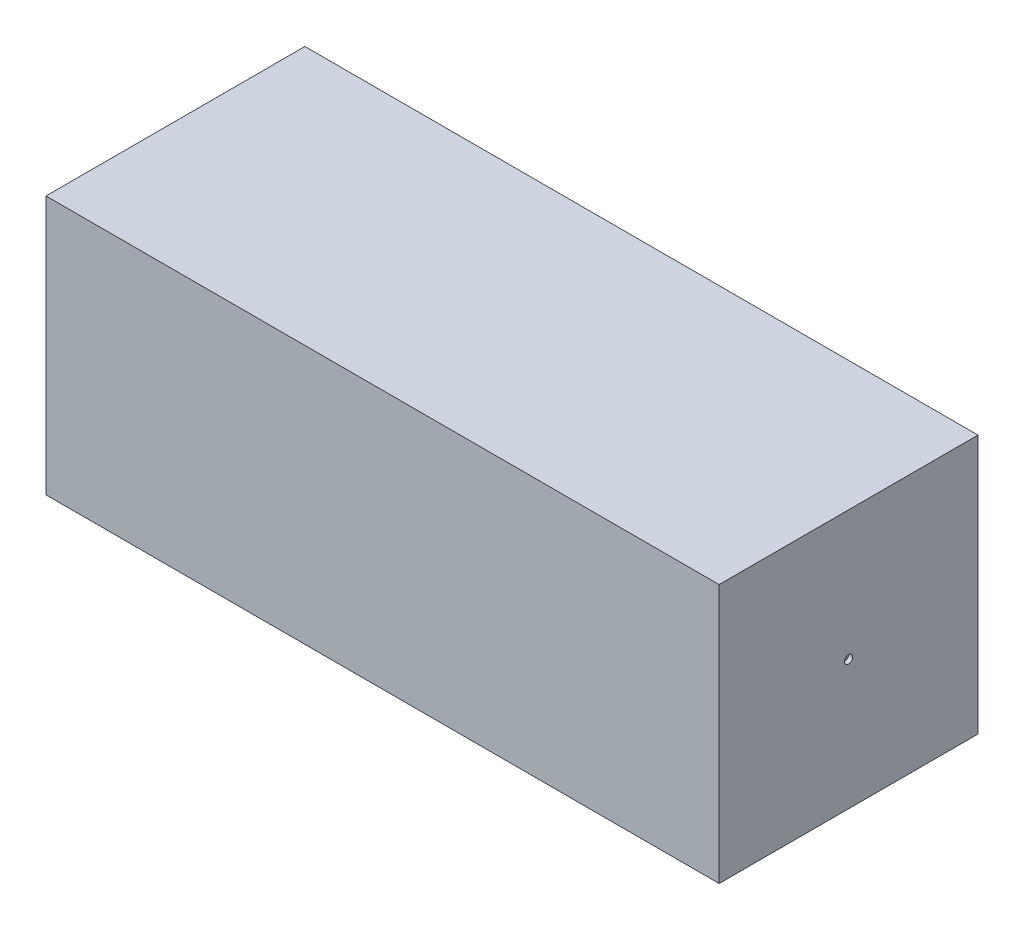
ISO-10303-21;
HEADER;
FILE_DESCRIPTION(('STEP AP214'),'2;1');
FILE_NAME('part.step','',(''),(''),'','','');
FILE_SCHEMA(('AUTOMOTIVE_DESIGN { 1 0 10303 214 1 1 1 1 }'));
ENDSEC;
DATA;
#1=APPLICATION_CONTEXT('core data for automotive mechanical design processes');
#2=APPLICATION_PROTOCOL_DEFINITION('international standard','automotive_design',2000,#1);
#3=PRODUCT_CONTEXT('',#1,'mechanical');
#4=PRODUCT('Part','Part','',(#3));
#5=PRODUCT_RELATED_PRODUCT_CATEGORY('part','',(#4));
#6=PRODUCT_DEFINITION_FORMATION('','',#4);
#7=PRODUCT_DEFINITION_CONTEXT('part definition',#1,'design');
#8=PRODUCT_DEFINITION('design','',#6,#7);
#9=PRODUCT_DEFINITION_SHAPE('','',#8);
#10=(LENGTH_UNIT() NAMED_UNIT(*) SI_UNIT(.MILLI.,.METRE.));
#11=(NAMED_UNIT(*) PLANE_ANGLE_UNIT() SI_UNIT($,.RADIAN.));
#12=(NAMED_UNIT(*) SI_UNIT($,.STERADIAN.) SOLID_ANGLE_UNIT());
#13=UNCERTAINTY_MEASURE_WITH_UNIT(LENGTH_MEASURE(1.E-05),#10,'distance_accuracy_value','');
#14=(GEOMETRIC_REPRESENTATION_CONTEXT(3) GLOBAL_UNCERTAINTY_ASSIGNED_CONTEXT((#13)) GLOBAL_UNIT_ASSIGNED_CONTEXT((#10,
#11,#12)) REPRESENTATION_CONTEXT('',''));
#15=CARTESIAN_POINT('',(0.,0.,0.));
#16=DIRECTION('',(0.,0.,1.));
#17=DIRECTION('',(1.,0.,0.));
#18=AXIS2_PLACEMENT_3D('',#15,#16,#17);
#19=CARTESIAN_POINT('',(164.1,31.75,-31.75));
#20=DIRECTION('',(1.,0.,0.));
#21=DIRECTION('',(0.,1.,0.));
#22=AXIS2_PLACEMENT_3D('',#19,#20,#21);
#23=PLANE('',#22);
#24=CARTESIAN_POINT('',(164.1,31.75,-31.75));
#25=DIRECTION('',(1.,0.,0.));
#26=DIRECTION('',(0.,0.,-1.));
#27=AXIS2_PLACEMENT_3D('',#24,#25,#26);
#28=CIRCLE('',#27,1.);
#29=CARTESIAN_POINT('',(164.1,31.75,-32.75));
#30=VERTEX_POINT('',#29);
#31=EDGE_CURVE('E11',#30,#30,#28,.T.);
#32=ORIENTED_EDGE('',*,*,#31,.T.);
#33=EDGE_LOOP('',(#32));
#34=FACE_BOUND('',#33,.T.);
#35=ADVANCED_FACE('F17',(#34),#23,.T.);
#36=CARTESIAN_POINT('',(164.1,31.75,-31.75));
#37=DIRECTION('',(1.,0.,0.));
#38=DIRECTION('',(0.,0.,-1.));
#39=AXIS2_PLACEMENT_3D('',#36,#37,#38);
#40=CYLINDRICAL_SURFACE('',#39,1.);
#41=ORIENTED_EDGE('',*,*,#31,.F.);
#42=EDGE_LOOP('',(#41));
#43=FACE_BOUND('',#42,.T.);
#44=CARTESIAN_POINT('',(165.1,31.75,-31.75));
#45=DIRECTION('',(1.,0.,0.));
#46=DIRECTION('',(0.,0.,-1.));
#47=AXIS2_PLACEMENT_3D('',#44,#45,#46);
#48=CIRCLE('',#47,1.);
#49=CARTESIAN_POINT('',(165.1,31.75,-32.75));
#50=VERTEX_POINT('',#49);
#51=EDGE_CURVE('E45',#50,#50,#48,.T.);
#52=ORIENTED_EDGE('',*,*,#51,.T.);
#53=EDGE_LOOP('',(#52));
#54=FACE_BOUND('',#53,.T.);
#55=ADVANCED_FACE('F163',(#43,#54),#40,.F.);
#56=CARTESIAN_POINT('',(0.,0.,0.));
#57=DIRECTION('',(0.,-1.,0.));
#58=DIRECTION('',(0.,0.,-1.));
#59=AXIS2_PLACEMENT_3D('',#56,#57,#58);
#60=PLANE('',#59);
#61=DIRECTION('',(0.,0.,1.));
#62=VECTOR('',#61,1.);
#63=CARTESIAN_POINT('',(0.,0.,0.));
#64=LINE('',#63,#62);
#65=CARTESIAN_POINT('',(0.,0.,-63.5));
#66=VERTEX_POINT('',#65);
#67=CARTESIAN_POINT('',(0.,0.,0.));
#68=VERTEX_POINT('',#67);
#69=EDGE_CURVE('E100',#66,#68,#64,.T.);
#70=ORIENTED_EDGE('',*,*,#69,.F.);
#71=DIRECTION('',(-1.,0.,0.));
#72=VECTOR('',#71,1.);
#73=CARTESIAN_POINT('',(0.,0.,-63.5));
#74=LINE('',#73,#72);
#75=CARTESIAN_POINT('',(165.1,0.,-63.5));
#76=VERTEX_POINT('',#75);
#77=EDGE_CURVE('E84',#76,#66,#74,.T.);
#78=ORIENTED_EDGE('',*,*,#77,.F.);
#79=DIRECTION('',(0.,0.,-1.));
#80=VECTOR('',#79,1.);
#81=CARTESIAN_POINT('',(165.1,0.,0.));
#82=LINE('',#81,#80);
#83=CARTESIAN_POINT('',(165.1,0.,0.));
#84=VERTEX_POINT('',#83);
#85=EDGE_CURVE('E102',#84,#76,#82,.T.);
#86=ORIENTED_EDGE('',*,*,#85,.F.);
#87=DIRECTION('',(1.,0.,0.));
#88=VECTOR('',#87,1.);
#89=CARTESIAN_POINT('',(0.,0.,0.));
#90=LINE('',#89,#88);
#91=EDGE_CURVE('E96',#68,#84,#90,.T.);
#92=ORIENTED_EDGE('',*,*,#91,.F.);
#93=EDGE_LOOP('',(#70,#78,#86,#92));
#94=FACE_BOUND('',#93,.T.);
#95=ADVANCED_FACE('F98',(#94),#60,.T.);
#96=CARTESIAN_POINT('',(0.,63.5,0.));
#97=DIRECTION('',(0.,-1.,0.));
#98=DIRECTION('',(0.,0.,-1.));
#99=AXIS2_PLACEMENT_3D('',#96,#97,#98);
#100=PLANE('',#99);
#101=DIRECTION('',(0.,0.,1.));
#102=VECTOR('',#101,1.);
#103=CARTESIAN_POINT('',(0.,63.5,0.));
#104=LINE('',#103,#102);
#105=CARTESIAN_POINT('',(0.,63.5,-63.5));
#106=VERTEX_POINT('',#105);
#107=CARTESIAN_POINT('',(0.,63.5,0.));
#108=VERTEX_POINT('',#107);
#109=EDGE_CURVE('E117',#106,#108,#104,.T.);
#110=ORIENTED_EDGE('',*,*,#109,.T.);
#111=DIRECTION('',(1.,0.,0.));
#112=VECTOR('',#111,1.);
#113=CARTESIAN_POINT('',(0.,63.5,0.));
#114=LINE('',#113,#112);
#115=CARTESIAN_POINT('',(165.1,63.5,0.));
#116=VERTEX_POINT('',#115);
#117=EDGE_CURVE('E112',#108,#116,#114,.T.);
#118=ORIENTED_EDGE('',*,*,#117,.T.);
#119=DIRECTION('',(0.,0.,-1.));
#120=VECTOR('',#119,1.);
#121=CARTESIAN_POINT('',(165.1,63.5,0.));
#122=LINE('',#121,#120);
#123=CARTESIAN_POINT('',(165.1,63.5,-63.5));
#124=VERTEX_POINT('',#123);
#125=EDGE_CURVE('E72',#116,#124,#122,.T.);
#126=ORIENTED_EDGE('',*,*,#125,.T.);
#127=DIRECTION('',(-1.,0.,0.));
#128=VECTOR('',#127,1.);
#129=CARTESIAN_POINT('',(0.,63.5,-63.5));
#130=LINE('',#129,#128);
#131=EDGE_CURVE('E25',#124,#106,#130,.T.);
#132=ORIENTED_EDGE('',*,*,#131,.T.);
#133=EDGE_LOOP('',(#110,#118,#126,#132));
#134=FACE_BOUND('',#133,.T.);
#135=ADVANCED_FACE('F148',(#134),#100,.F.);
#136=CARTESIAN_POINT('',(0.,63.5,-63.5));
#137=DIRECTION('',(0.,0.,1.));
#138=DIRECTION('',(1.,0.,0.));
#139=AXIS2_PLACEMENT_3D('',#136,#137,#138);
#140=PLANE('',#139);
#141=ORIENTED_EDGE('',*,*,#77,.T.);
#142=DIRECTION('',(0.,-1.,0.));
#143=VECTOR('',#142,1.);
#144=CARTESIAN_POINT('',(0.,63.5,-63.5));
#145=LINE('',#144,#143);
#146=EDGE_CURVE('E107',#106,#66,#145,.T.);
#147=ORIENTED_EDGE('',*,*,#146,.F.);
#148=ORIENTED_EDGE('',*,*,#131,.F.);
#149=DIRECTION('',(0.,-1.,0.));
#150=VECTOR('',#149,1.);
#151=CARTESIAN_POINT('',(165.1,63.5,-63.5));
#152=LINE('',#151,#150);
#153=EDGE_CURVE('E138',#124,#76,#152,.T.);
#154=ORIENTED_EDGE('',*,*,#153,.T.);
#155=EDGE_LOOP('',(#141,#147,#148,#154));
#156=FACE_BOUND('',#155,.T.);
#157=ADVANCED_FACE('F149',(#156),#140,.F.);
#158=CARTESIAN_POINT('',(165.1,63.5,0.));
#159=DIRECTION('',(-1.,0.,0.));
#160=DIRECTION('',(0.,0.,1.));
#161=AXIS2_PLACEMENT_3D('',#158,#159,#160);
#162=PLANE('',#161);
#163=ORIENTED_EDGE('',*,*,#51,.F.);
#164=EDGE_LOOP('',(#163));
#165=FACE_BOUND('',#164,.T.);
#166=ORIENTED_EDGE('',*,*,#85,.T.);
#167=ORIENTED_EDGE('',*,*,#153,.F.);
#168=ORIENTED_EDGE('',*,*,#125,.F.);
#169=DIRECTION('',(0.,-1.,0.));
#170=VECTOR('',#169,1.);
#171=CARTESIAN_POINT('',(165.1,63.5,0.));
#172=LINE('',#171,#170);
#173=EDGE_CURVE('E106',#116,#84,#172,.T.);
#174=ORIENTED_EDGE('',*,*,#173,.T.);
#175=EDGE_LOOP('',(#166,#167,#168,#174));
#176=FACE_BOUND('',#175,.T.);
#177=ADVANCED_FACE('F151',(#165,#176),#162,.F.);
#178=CARTESIAN_POINT('',(0.,63.5,0.));
#179=DIRECTION('',(0.,0.,-1.));
#180=DIRECTION('',(0.,-1.,0.));
#181=AXIS2_PLACEMENT_3D('',#178,#179,#180);
#182=PLANE('',#181);
#183=ORIENTED_EDGE('',*,*,#91,.T.);
#184=ORIENTED_EDGE('',*,*,#173,.F.);
#185=ORIENTED_EDGE('',*,*,#117,.F.);
#186=DIRECTION('',(0.,-1.,0.));
#187=VECTOR('',#186,1.);
#188=CARTESIAN_POINT('',(0.,63.5,0.));
#189=LINE('',#188,#187);
#190=EDGE_CURVE('E110',#108,#68,#189,.T.);
#191=ORIENTED_EDGE('',*,*,#190,.T.);
#192=EDGE_LOOP('',(#183,#184,#185,#191));
#193=FACE_BOUND('',#192,.T.);
#194=ADVANCED_FACE('F111',(#193),#182,.F.);
#195=CARTESIAN_POINT('',(0.,63.5,0.));
#196=DIRECTION('',(1.,0.,0.));
#197=DIRECTION('',(0.,0.,1.));
#198=AXIS2_PLACEMENT_3D('',#195,#196,#197);
#199=PLANE('',#198);
#200=ORIENTED_EDGE('',*,*,#69,.T.);
#201=ORIENTED_EDGE('',*,*,#190,.F.);
#202=ORIENTED_EDGE('',*,*,#109,.F.);
#203=ORIENTED_EDGE('',*,*,#146,.T.);
#204=EDGE_LOOP('',(#200,#201,#202,#203));
#205=FACE_BOUND('',#204,.T.);
#206=ADVANCED_FACE('F119',(#205),#199,.F.);
#207=CLOSED_SHELL('',(#35,#55,#95,#135,#157,#177,#194,#206));
#208=MANIFOLD_SOLID_BREP('B1',#207);
#209=ADVANCED_BREP_SHAPE_REPRESENTATION('',(#18,#208),#14);
#210=SHAPE_DEFINITION_REPRESENTATION(#9,#209);
ENDSEC;
END-ISO-10303-21;
